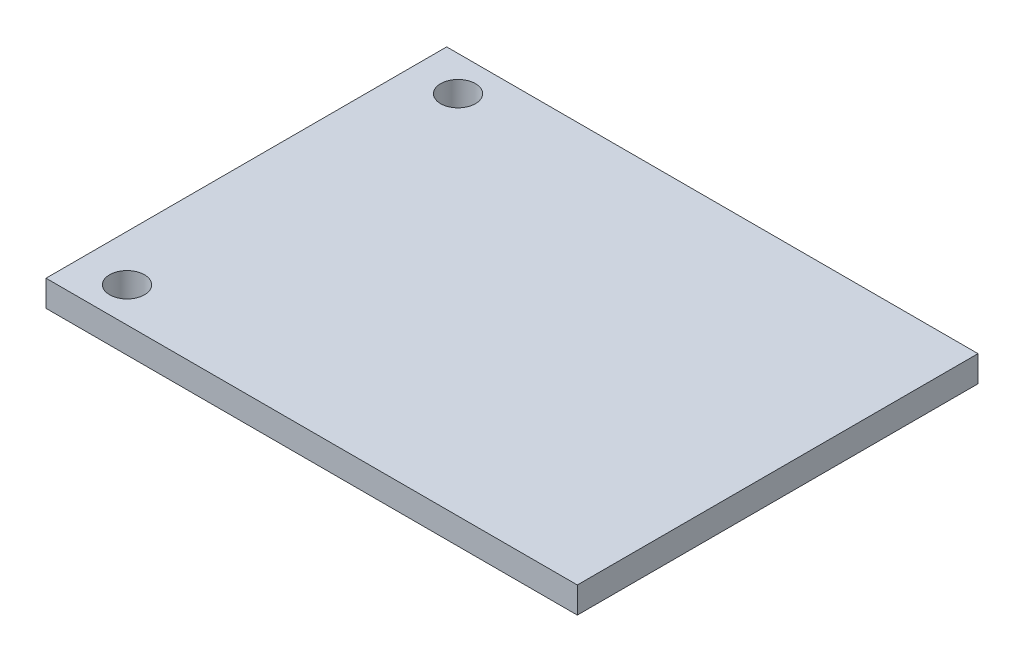
ISO-10303-21;
HEADER;
FILE_DESCRIPTION(('STEP AP214'),'2;1');
FILE_NAME('part.step','',(''),(''),'','','');
FILE_SCHEMA(('AUTOMOTIVE_DESIGN { 1 0 10303 214 1 1 1 1 }'));
ENDSEC;
DATA;
#1=APPLICATION_CONTEXT('core data for automotive mechanical design processes');
#2=APPLICATION_PROTOCOL_DEFINITION('international standard','automotive_design',2000,#1);
#3=PRODUCT_CONTEXT('',#1,'mechanical');
#4=PRODUCT('Part','Part','',(#3));
#5=PRODUCT_RELATED_PRODUCT_CATEGORY('part','',(#4));
#6=PRODUCT_DEFINITION_FORMATION('','',#4);
#7=PRODUCT_DEFINITION_CONTEXT('part definition',#1,'design');
#8=PRODUCT_DEFINITION('design','',#6,#7);
#9=PRODUCT_DEFINITION_SHAPE('','',#8);
#10=(LENGTH_UNIT() NAMED_UNIT(*) SI_UNIT(.MILLI.,.METRE.));
#11=(NAMED_UNIT(*) PLANE_ANGLE_UNIT() SI_UNIT($,.RADIAN.));
#12=(NAMED_UNIT(*) SI_UNIT($,.STERADIAN.) SOLID_ANGLE_UNIT());
#13=UNCERTAINTY_MEASURE_WITH_UNIT(LENGTH_MEASURE(1.E-05),#10,'distance_accuracy_value','');
#14=(GEOMETRIC_REPRESENTATION_CONTEXT(3) GLOBAL_UNCERTAINTY_ASSIGNED_CONTEXT((#13)) GLOBAL_UNIT_ASSIGNED_CONTEXT((#10,
#11,#12)) REPRESENTATION_CONTEXT('',''));
#15=CARTESIAN_POINT('',(0.,0.,0.));
#16=DIRECTION('',(0.,0.,1.));
#17=DIRECTION('',(1.,0.,0.));
#18=AXIS2_PLACEMENT_3D('',#15,#16,#17);
#19=CARTESIAN_POINT('',(15.25,1.5,0.));
#20=DIRECTION('',(1.,0.,0.));
#21=DIRECTION('',(0.,0.,-1.));
#22=AXIS2_PLACEMENT_3D('',#19,#20,#21);
#23=PLANE('',#22);
#24=DIRECTION('',(0.,0.,1.));
#25=VECTOR('',#24,1.);
#26=CARTESIAN_POINT('',(15.25,0.,0.));
#27=LINE('',#26,#25);
#28=CARTESIAN_POINT('',(15.25,0.,-11.5));
#29=VERTEX_POINT('',#28);
#30=CARTESIAN_POINT('',(15.25,0.,11.5));
#31=VERTEX_POINT('',#30);
#32=EDGE_CURVE('E127',#29,#31,#27,.T.);
#33=ORIENTED_EDGE('',*,*,#32,.F.);
#34=DIRECTION('',(0.,-1.,0.));
#35=VECTOR('',#34,1.);
#36=CARTESIAN_POINT('',(15.25,1.5,-11.5));
#37=LINE('',#36,#35);
#38=CARTESIAN_POINT('',(15.25,1.5,-11.5));
#39=VERTEX_POINT('',#38);
#40=EDGE_CURVE('E11',#39,#29,#37,.T.);
#41=ORIENTED_EDGE('',*,*,#40,.F.);
#42=DIRECTION('',(0.,0.,1.));
#43=VECTOR('',#42,1.);
#44=CARTESIAN_POINT('',(15.25,1.5,0.));
#45=LINE('',#44,#43);
#46=CARTESIAN_POINT('',(15.25,1.5,11.5));
#47=VERTEX_POINT('',#46);
#48=EDGE_CURVE('E109',#39,#47,#45,.T.);
#49=ORIENTED_EDGE('',*,*,#48,.T.);
#50=DIRECTION('',(0.,-1.,0.));
#51=VECTOR('',#50,1.);
#52=CARTESIAN_POINT('',(15.25,1.5,11.5));
#53=LINE('',#52,#51);
#54=EDGE_CURVE('E86',#47,#31,#53,.T.);
#55=ORIENTED_EDGE('',*,*,#54,.T.);
#56=EDGE_LOOP('',(#33,#41,#49,#55));
#57=FACE_BOUND('',#56,.T.);
#58=ADVANCED_FACE('F45',(#57),#23,.T.);
#59=CARTESIAN_POINT('',(0.,1.5,-11.5));
#60=DIRECTION('',(0.,0.,-1.));
#61=DIRECTION('',(-1.,0.,0.));
#62=AXIS2_PLACEMENT_3D('',#59,#60,#61);
#63=PLANE('',#62);
#64=DIRECTION('',(1.,0.,0.));
#65=VECTOR('',#64,1.);
#66=CARTESIAN_POINT('',(0.,0.,-11.5));
#67=LINE('',#66,#65);
#68=CARTESIAN_POINT('',(-15.25,0.,-11.5));
#69=VERTEX_POINT('',#68);
#70=EDGE_CURVE('E98',#69,#29,#67,.T.);
#71=ORIENTED_EDGE('',*,*,#70,.F.);
#72=DIRECTION('',(0.,-1.,0.));
#73=VECTOR('',#72,1.);
#74=CARTESIAN_POINT('',(-15.25,1.5,-11.5));
#75=LINE('',#74,#73);
#76=CARTESIAN_POINT('',(-15.25,1.5,-11.5));
#77=VERTEX_POINT('',#76);
#78=EDGE_CURVE('E55',#77,#69,#75,.T.);
#79=ORIENTED_EDGE('',*,*,#78,.F.);
#80=DIRECTION('',(1.,0.,0.));
#81=VECTOR('',#80,1.);
#82=CARTESIAN_POINT('',(0.,1.5,-11.5));
#83=LINE('',#82,#81);
#84=EDGE_CURVE('E96',#77,#39,#83,.T.);
#85=ORIENTED_EDGE('',*,*,#84,.T.);
#86=ORIENTED_EDGE('',*,*,#40,.T.);
#87=EDGE_LOOP('',(#71,#79,#85,#86));
#88=FACE_BOUND('',#87,.T.);
#89=ADVANCED_FACE('F94',(#88),#63,.T.);
#90=CARTESIAN_POINT('',(-15.25,1.5,0.));
#91=DIRECTION('',(1.,0.,0.));
#92=DIRECTION('',(0.,0.,-1.));
#93=AXIS2_PLACEMENT_3D('',#90,#91,#92);
#94=PLANE('',#93);
#95=DIRECTION('',(0.,0.,1.));
#96=VECTOR('',#95,1.);
#97=CARTESIAN_POINT('',(-15.25,0.,0.));
#98=LINE('',#97,#96);
#99=CARTESIAN_POINT('',(-15.25,0.,11.5));
#100=VERTEX_POINT('',#99);
#101=EDGE_CURVE('E132',#69,#100,#98,.T.);
#102=ORIENTED_EDGE('',*,*,#101,.T.);
#103=DIRECTION('',(0.,-1.,0.));
#104=VECTOR('',#103,1.);
#105=CARTESIAN_POINT('',(-15.25,1.5,11.5));
#106=LINE('',#105,#104);
#107=CARTESIAN_POINT('',(-15.25,1.5,11.5));
#108=VERTEX_POINT('',#107);
#109=EDGE_CURVE('E102',#108,#100,#106,.T.);
#110=ORIENTED_EDGE('',*,*,#109,.F.);
#111=DIRECTION('',(0.,0.,1.));
#112=VECTOR('',#111,1.);
#113=CARTESIAN_POINT('',(-15.25,1.5,0.));
#114=LINE('',#113,#112);
#115=EDGE_CURVE('E104',#77,#108,#114,.T.);
#116=ORIENTED_EDGE('',*,*,#115,.F.);
#117=ORIENTED_EDGE('',*,*,#78,.T.);
#118=EDGE_LOOP('',(#102,#110,#116,#117));
#119=FACE_BOUND('',#118,.T.);
#120=ADVANCED_FACE('F105',(#119),#94,.F.);
#121=CARTESIAN_POINT('',(-12.5978260869565,1.5,-9.5));
#122=DIRECTION('',(0.,-1.,0.));
#123=DIRECTION('',(0.,0.,-1.));
#124=AXIS2_PLACEMENT_3D('',#121,#122,#123);
#125=CYLINDRICAL_SURFACE('',#124,1.);
#126=CARTESIAN_POINT('',(-12.5978260869565,1.5,-9.5));
#127=DIRECTION('',(0.,1.,0.));
#128=DIRECTION('',(0.,0.,1.));
#129=AXIS2_PLACEMENT_3D('',#126,#127,#128);
#130=CIRCLE('',#129,1.);
#131=CARTESIAN_POINT('',(-12.5978260869565,1.5,-8.5));
#132=VERTEX_POINT('',#131);
#133=EDGE_CURVE('E113',#132,#132,#130,.T.);
#134=ORIENTED_EDGE('',*,*,#133,.T.);
#135=EDGE_LOOP('',(#134));
#136=FACE_BOUND('',#135,.T.);
#137=CARTESIAN_POINT('',(-12.5978260869565,0.,-9.5));
#138=DIRECTION('',(0.,1.,0.));
#139=DIRECTION('',(0.,0.,1.));
#140=AXIS2_PLACEMENT_3D('',#137,#138,#139);
#141=CIRCLE('',#140,1.);
#142=CARTESIAN_POINT('',(-12.5978260869565,0.,-8.5));
#143=VERTEX_POINT('',#142);
#144=EDGE_CURVE('E123',#143,#143,#141,.T.);
#145=ORIENTED_EDGE('',*,*,#144,.F.);
#146=EDGE_LOOP('',(#145));
#147=FACE_BOUND('',#146,.T.);
#148=ADVANCED_FACE('F151',(#136,#147),#125,.F.);
#149=CARTESIAN_POINT('',(-12.5978260869565,1.5,9.5));
#150=DIRECTION('',(0.,-1.,0.));
#151=DIRECTION('',(0.,0.,-1.));
#152=AXIS2_PLACEMENT_3D('',#149,#150,#151);
#153=CYLINDRICAL_SURFACE('',#152,1.);
#154=CARTESIAN_POINT('',(-12.5978260869565,1.5,9.5));
#155=DIRECTION('',(0.,1.,0.));
#156=DIRECTION('',(0.,0.,1.));
#157=AXIS2_PLACEMENT_3D('',#154,#155,#156);
#158=CIRCLE('',#157,1.);
#159=CARTESIAN_POINT('',(-12.5978260869565,1.5,10.5));
#160=VERTEX_POINT('',#159);
#161=EDGE_CURVE('E137',#160,#160,#158,.T.);
#162=ORIENTED_EDGE('',*,*,#161,.T.);
#163=EDGE_LOOP('',(#162));
#164=FACE_BOUND('',#163,.T.);
#165=CARTESIAN_POINT('',(-12.5978260869565,0.,9.5));
#166=DIRECTION('',(0.,1.,0.));
#167=DIRECTION('',(0.,0.,1.));
#168=AXIS2_PLACEMENT_3D('',#165,#166,#167);
#169=CIRCLE('',#168,1.);
#170=CARTESIAN_POINT('',(-12.5978260869565,0.,10.5));
#171=VERTEX_POINT('',#170);
#172=EDGE_CURVE('E119',#171,#171,#169,.T.);
#173=ORIENTED_EDGE('',*,*,#172,.F.);
#174=EDGE_LOOP('',(#173));
#175=FACE_BOUND('',#174,.T.);
#176=ADVANCED_FACE('F47',(#164,#175),#153,.F.);
#177=CARTESIAN_POINT('',(0.,1.5,11.5));
#178=DIRECTION('',(0.,0.,-1.));
#179=DIRECTION('',(-1.,0.,0.));
#180=AXIS2_PLACEMENT_3D('',#177,#178,#179);
#181=PLANE('',#180);
#182=DIRECTION('',(1.,0.,0.));
#183=VECTOR('',#182,1.);
#184=CARTESIAN_POINT('',(0.,0.,11.5));
#185=LINE('',#184,#183);
#186=EDGE_CURVE('E79',#100,#31,#185,.T.);
#187=ORIENTED_EDGE('',*,*,#186,.T.);
#188=ORIENTED_EDGE('',*,*,#54,.F.);
#189=DIRECTION('',(1.,0.,0.));
#190=VECTOR('',#189,1.);
#191=CARTESIAN_POINT('',(0.,1.5,11.5));
#192=LINE('',#191,#190);
#193=EDGE_CURVE('E63',#108,#47,#192,.T.);
#194=ORIENTED_EDGE('',*,*,#193,.F.);
#195=ORIENTED_EDGE('',*,*,#109,.T.);
#196=EDGE_LOOP('',(#187,#188,#194,#195));
#197=FACE_BOUND('',#196,.T.);
#198=ADVANCED_FACE('F142',(#197),#181,.F.);
#199=CARTESIAN_POINT('',(0.,1.5,0.));
#200=DIRECTION('',(0.,1.,0.));
#201=DIRECTION('',(0.,0.,1.));
#202=AXIS2_PLACEMENT_3D('',#199,#200,#201);
#203=PLANE('',#202);
#204=ORIENTED_EDGE('',*,*,#161,.F.);
#205=EDGE_LOOP('',(#204));
#206=FACE_BOUND('',#205,.T.);
#207=ORIENTED_EDGE('',*,*,#133,.F.);
#208=EDGE_LOOP('',(#207));
#209=FACE_BOUND('',#208,.T.);
#210=ORIENTED_EDGE('',*,*,#48,.F.);
#211=ORIENTED_EDGE('',*,*,#84,.F.);
#212=ORIENTED_EDGE('',*,*,#115,.T.);
#213=ORIENTED_EDGE('',*,*,#193,.T.);
#214=EDGE_LOOP('',(#210,#211,#212,#213));
#215=FACE_BOUND('',#214,.T.);
#216=ADVANCED_FACE('F108',(#206,#209,#215),#203,.T.);
#217=CARTESIAN_POINT('',(0.,0.,0.));
#218=DIRECTION('',(0.,1.,0.));
#219=DIRECTION('',(0.,0.,1.));
#220=AXIS2_PLACEMENT_3D('',#217,#218,#219);
#221=PLANE('',#220);
#222=ORIENTED_EDGE('',*,*,#172,.T.);
#223=EDGE_LOOP('',(#222));
#224=FACE_BOUND('',#223,.T.);
#225=ORIENTED_EDGE('',*,*,#144,.T.);
#226=EDGE_LOOP('',(#225));
#227=FACE_BOUND('',#226,.T.);
#228=ORIENTED_EDGE('',*,*,#32,.T.);
#229=ORIENTED_EDGE('',*,*,#186,.F.);
#230=ORIENTED_EDGE('',*,*,#101,.F.);
#231=ORIENTED_EDGE('',*,*,#70,.T.);
#232=EDGE_LOOP('',(#228,#229,#230,#231));
#233=FACE_BOUND('',#232,.T.);
#234=ADVANCED_FACE('F143',(#224,#227,#233),#221,.F.);
#235=CLOSED_SHELL('',(#58,#89,#120,#148,#176,#198,#216,#234));
#236=MANIFOLD_SOLID_BREP('B2',#235);
#237=ADVANCED_BREP_SHAPE_REPRESENTATION('',(#18,#236),#14);
#238=SHAPE_DEFINITION_REPRESENTATION(#9,#237);
ENDSEC;
END-ISO-10303-21;
